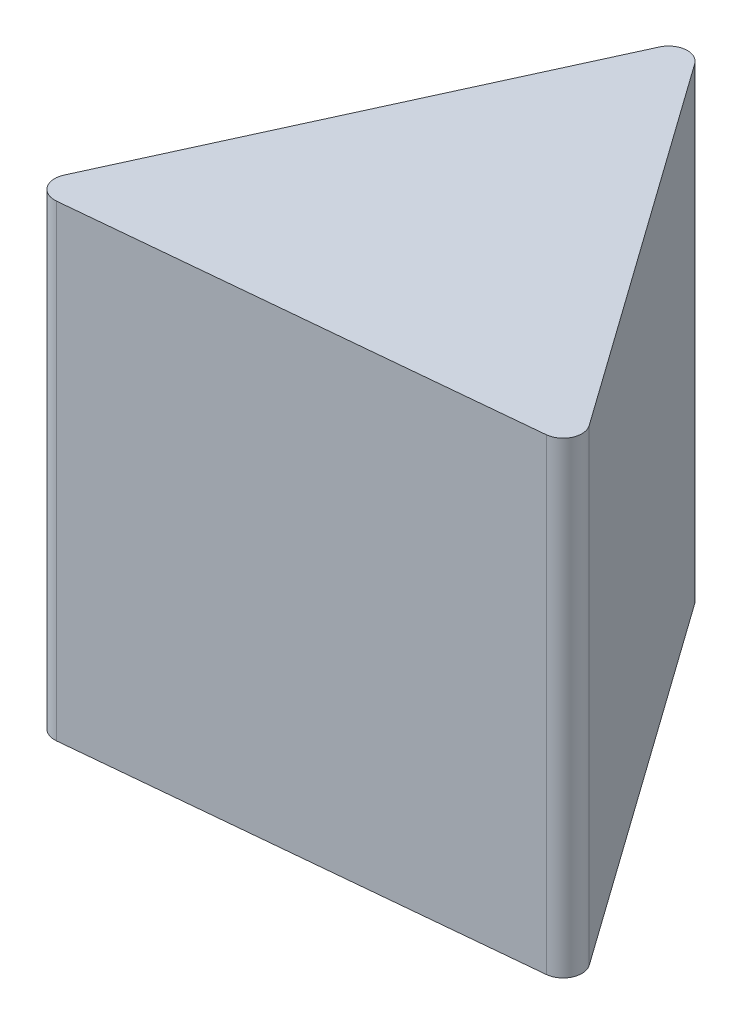
ISO-10303-21;
HEADER;
FILE_DESCRIPTION(('STEP AP214'),'2;1');
FILE_NAME('part.step','',(''),(''),'','','');
FILE_SCHEMA(('AUTOMOTIVE_DESIGN { 1 0 10303 214 1 1 1 1 }'));
ENDSEC;
DATA;
#1=APPLICATION_CONTEXT('core data for automotive mechanical design processes');
#2=APPLICATION_PROTOCOL_DEFINITION('international standard','automotive_design',2000,#1);
#3=PRODUCT_CONTEXT('',#1,'mechanical');
#4=PRODUCT('Part','Part','',(#3));
#5=PRODUCT_RELATED_PRODUCT_CATEGORY('part','',(#4));
#6=PRODUCT_DEFINITION_FORMATION('','',#4);
#7=PRODUCT_DEFINITION_CONTEXT('part definition',#1,'design');
#8=PRODUCT_DEFINITION('design','',#6,#7);
#9=PRODUCT_DEFINITION_SHAPE('','',#8);
#10=(LENGTH_UNIT() NAMED_UNIT(*) SI_UNIT(.MILLI.,.METRE.));
#11=(NAMED_UNIT(*) PLANE_ANGLE_UNIT() SI_UNIT($,.RADIAN.));
#12=(NAMED_UNIT(*) SI_UNIT($,.STERADIAN.) SOLID_ANGLE_UNIT());
#13=UNCERTAINTY_MEASURE_WITH_UNIT(LENGTH_MEASURE(1.E-05),#10,'distance_accuracy_value','');
#14=(GEOMETRIC_REPRESENTATION_CONTEXT(3) GLOBAL_UNCERTAINTY_ASSIGNED_CONTEXT((#13)) GLOBAL_UNIT_ASSIGNED_CONTEXT((#10,
#11,#12)) REPRESENTATION_CONTEXT('',''));
#15=CARTESIAN_POINT('',(0.,0.,0.));
#16=DIRECTION('',(0.,0.,1.));
#17=DIRECTION('',(1.,0.,0.));
#18=AXIS2_PLACEMENT_3D('',#15,#16,#17);
#19=CARTESIAN_POINT('',(-32.8401755263723,63.5,23.3730491529478));
#20=DIRECTION('',(-0.0948079174529441,0.,-0.995495584514686));
#21=DIRECTION('',(-0.995495584514686,0.,0.0948079174529441));
#22=AXIS2_PLACEMENT_3D('',#19,#20,#21);
#23=PLANE('',#22);
#24=DIRECTION('',(0.995495584514686,0.,-0.0948079174529441));
#25=VECTOR('',#24,1.);
#26=CARTESIAN_POINT('',(-32.8401755263723,0.,23.3730491529478));
#27=LINE('',#26,#25);
#28=CARTESIAN_POINT('',(-28.4605832414039,0.,22.9559503427775));
#29=VERTEX_POINT('',#28);
#30=CARTESIAN_POINT('',(32.2821498085729,0.,17.1710005042748));
#31=VERTEX_POINT('',#30);
#32=EDGE_CURVE('E138',#29,#31,#27,.T.);
#33=ORIENTED_EDGE('',*,*,#32,.T.);
#34=DIRECTION('',(0.,-1.,0.));
#35=VECTOR('',#34,1.);
#36=CARTESIAN_POINT('',(32.2821498085729,63.5,17.1710005042748));
#37=LINE('',#36,#35);
#38=CARTESIAN_POINT('',(32.2821498085729,63.5,17.1710005042748));
#39=VERTEX_POINT('',#38);
#40=EDGE_CURVE('E11',#31,#39,#37,.F.);
#41=ORIENTED_EDGE('',*,*,#40,.T.);
#42=DIRECTION('',(0.995495584514686,0.,-0.0948079174529441));
#43=VECTOR('',#42,1.);
#44=CARTESIAN_POINT('',(-32.8401755263723,63.5,23.3730491529478));
#45=LINE('',#44,#43);
#46=CARTESIAN_POINT('',(-28.4605832414039,63.5,22.9559503427775));
#47=VERTEX_POINT('',#46);
#48=EDGE_CURVE('E129',#47,#39,#45,.T.);
#49=ORIENTED_EDGE('',*,*,#48,.F.);
#50=DIRECTION('',(0.,-1.,0.));
#51=VECTOR('',#50,1.);
#52=CARTESIAN_POINT('',(-28.4605832414039,63.5,22.9559503427775));
#53=LINE('',#52,#51);
#54=EDGE_CURVE('E56',#47,#29,#53,.T.);
#55=ORIENTED_EDGE('',*,*,#54,.T.);
#56=EDGE_LOOP('',(#33,#41,#49,#55));
#57=FACE_BOUND('',#56,.T.);
#58=ADVANCED_FACE('F47',(#57),#23,.F.);
#59=CARTESIAN_POINT('',(36.6617420935412,63.5,16.7539016941045));
#60=DIRECTION('',(-0.814720506818485,0.,0.57985385725149));
#61=DIRECTION('',(0.57985385725149,0.,0.814720506818485));
#62=AXIS2_PLACEMENT_3D('',#59,#60,#61);
#63=PLANE('',#62);
#64=DIRECTION('',(-0.57985385725149,0.,-0.814720506818485));
#65=VECTOR('',#64,1.);
#66=CARTESIAN_POINT('',(36.6617420935412,0.,16.7539016941045));
#67=LINE('',#66,#65);
#68=CARTESIAN_POINT('',(34.1107277855613,0.,13.1696129221887));
#69=VERTEX_POINT('',#68);
#70=CARTESIAN_POINT('',(-1.27055225918907,0.,-36.5426620751364));
#71=VERTEX_POINT('',#70);
#72=EDGE_CURVE('E130',#69,#71,#67,.T.);
#73=ORIENTED_EDGE('',*,*,#72,.T.);
#74=DIRECTION('',(0.,-1.,0.));
#75=VECTOR('',#74,1.);
#76=CARTESIAN_POINT('',(-1.27055225918907,63.5,-36.5426620751364));
#77=LINE('',#76,#75);
#78=CARTESIAN_POINT('',(-1.27055225918907,63.5,-36.5426620751364));
#79=VERTEX_POINT('',#78);
#80=EDGE_CURVE('E106',#71,#79,#77,.F.);
#81=ORIENTED_EDGE('',*,*,#80,.T.);
#82=DIRECTION('',(-0.57985385725149,0.,-0.814720506818485));
#83=VECTOR('',#82,1.);
#84=CARTESIAN_POINT('',(36.6617420935412,63.5,16.7539016941045));
#85=LINE('',#84,#83);
#86=CARTESIAN_POINT('',(34.1107277855613,63.5,13.1696129221887));
#87=VERTEX_POINT('',#86);
#88=EDGE_CURVE('E135',#87,#79,#85,.T.);
#89=ORIENTED_EDGE('',*,*,#88,.F.);
#90=DIRECTION('',(0.,-1.,0.));
#91=VECTOR('',#90,1.);
#92=CARTESIAN_POINT('',(34.1107277855613,63.5,13.1696129221887));
#93=LINE('',#92,#91);
#94=EDGE_CURVE('E112',#87,#69,#93,.T.);
#95=ORIENTED_EDGE('',*,*,#94,.T.);
#96=EDGE_LOOP('',(#73,#81,#89,#95));
#97=FACE_BOUND('',#96,.T.);
#98=ADVANCED_FACE('F177',(#97),#63,.F.);
#99=CARTESIAN_POINT('',(-3.82156656716897,63.5,-40.1269508470522));
#100=DIRECTION('',(0.909528424271428,0.,0.415641727263196));
#101=DIRECTION('',(0.415641727263196,0.,-0.909528424271428));
#102=AXIS2_PLACEMENT_3D('',#99,#100,#101);
#103=PLANE('',#102);
#104=DIRECTION('',(-0.415641727263196,0.,0.909528424271428));
#105=VECTOR('',#104,1.);
#106=CARTESIAN_POINT('',(-3.82156656716897,63.5,-40.1269508470522));
#107=LINE('',#106,#105);
#108=CARTESIAN_POINT('',(-5.65014454415745,63.5,-36.1255632649662));
#109=VERTEX_POINT('',#108);
#110=CARTESIAN_POINT('',(-31.0115975493838,63.5,19.3716615708617));
#111=VERTEX_POINT('',#110);
#112=EDGE_CURVE('E121',#109,#111,#107,.T.);
#113=ORIENTED_EDGE('',*,*,#112,.F.);
#114=DIRECTION('',(0.,-1.,0.));
#115=VECTOR('',#114,1.);
#116=CARTESIAN_POINT('',(-5.65014454415745,63.5,-36.1255632649662));
#117=LINE('',#116,#115);
#118=CARTESIAN_POINT('',(-5.65014454415745,0.,-36.1255632649662));
#119=VERTEX_POINT('',#118);
#120=EDGE_CURVE('E105',#109,#119,#117,.T.);
#121=ORIENTED_EDGE('',*,*,#120,.T.);
#122=DIRECTION('',(-0.415641727263196,0.,0.909528424271428));
#123=VECTOR('',#122,1.);
#124=CARTESIAN_POINT('',(-3.82156656716897,0.,-40.1269508470522));
#125=LINE('',#124,#123);
#126=CARTESIAN_POINT('',(-31.0115975493838,0.,19.3716615708617));
#127=VERTEX_POINT('',#126);
#128=EDGE_CURVE('E119',#119,#127,#125,.T.);
#129=ORIENTED_EDGE('',*,*,#128,.T.);
#130=DIRECTION('',(0.,-1.,0.));
#131=VECTOR('',#130,1.);
#132=CARTESIAN_POINT('',(-31.0115975493838,63.5,19.3716615708617));
#133=LINE('',#132,#131);
#134=EDGE_CURVE('E124',#127,#111,#133,.F.);
#135=ORIENTED_EDGE('',*,*,#134,.T.);
#136=EDGE_LOOP('',(#113,#121,#129,#135));
#137=FACE_BOUND('',#136,.T.);
#138=ADVANCED_FACE('F118',(#137),#103,.F.);
#139=CARTESIAN_POINT('',(0.,63.5,0.));
#140=DIRECTION('',(0.,1.,0.));
#141=DIRECTION('',(0.,0.,1.));
#142=AXIS2_PLACEMENT_3D('',#139,#140,#141);
#143=PLANE('',#142);
#144=ORIENTED_EDGE('',*,*,#88,.T.);
#145=CARTESIAN_POINT('',(-3.33994234650802,63.5,-35.0698332777176));
#146=DIRECTION('',(0.,1.,0.));
#147=DIRECTION('',(0.,0.,1.));
#148=AXIS2_PLACEMENT_3D('',#145,#146,#147);
#149=CIRCLE('',#148,2.54);
#150=EDGE_CURVE('E157',#79,#109,#149,.T.);
#151=ORIENTED_EDGE('',*,*,#150,.T.);
#152=ORIENTED_EDGE('',*,*,#112,.T.);
#153=CARTESIAN_POINT('',(-28.7013953517344,63.5,20.4273915581102));
#154=DIRECTION('',(0.,1.,0.));
#155=DIRECTION('',(0.,0.,1.));
#156=AXIS2_PLACEMENT_3D('',#153,#154,#155);
#157=CIRCLE('',#156,2.54);
#158=EDGE_CURVE('E68',#111,#47,#157,.T.);
#159=ORIENTED_EDGE('',*,*,#158,.T.);
#160=ORIENTED_EDGE('',*,*,#48,.T.);
#161=CARTESIAN_POINT('',(32.0413376982424,63.5,14.6424417196075));
#162=DIRECTION('',(0.,1.,0.));
#163=DIRECTION('',(0.,0.,1.));
#164=AXIS2_PLACEMENT_3D('',#161,#162,#163);
#165=CIRCLE('',#164,2.54);
#166=EDGE_CURVE('E154',#39,#87,#165,.T.);
#167=ORIENTED_EDGE('',*,*,#166,.T.);
#168=EDGE_LOOP('',(#144,#151,#152,#159,#160,#167));
#169=FACE_BOUND('',#168,.T.);
#170=ADVANCED_FACE('F173',(#169),#143,.T.);
#171=CARTESIAN_POINT('',(0.,0.,0.));
#172=DIRECTION('',(0.,1.,0.));
#173=DIRECTION('',(0.,0.,1.));
#174=AXIS2_PLACEMENT_3D('',#171,#172,#173);
#175=PLANE('',#174);
#176=ORIENTED_EDGE('',*,*,#128,.F.);
#177=CARTESIAN_POINT('',(-3.33994234650802,0.,-35.0698332777176));
#178=DIRECTION('',(0.,1.,0.));
#179=DIRECTION('',(0.,0.,1.));
#180=AXIS2_PLACEMENT_3D('',#177,#178,#179);
#181=CIRCLE('',#180,2.54);
#182=EDGE_CURVE('E101',#119,#71,#181,.F.);
#183=ORIENTED_EDGE('',*,*,#182,.T.);
#184=ORIENTED_EDGE('',*,*,#72,.F.);
#185=CARTESIAN_POINT('',(32.0413376982424,0.,14.6424417196075));
#186=DIRECTION('',(0.,1.,0.));
#187=DIRECTION('',(0.,0.,1.));
#188=AXIS2_PLACEMENT_3D('',#185,#186,#187);
#189=CIRCLE('',#188,2.54);
#190=EDGE_CURVE('E113',#69,#31,#189,.F.);
#191=ORIENTED_EDGE('',*,*,#190,.T.);
#192=ORIENTED_EDGE('',*,*,#32,.F.);
#193=CARTESIAN_POINT('',(-28.7013953517344,0.,20.4273915581102));
#194=DIRECTION('',(0.,1.,0.));
#195=DIRECTION('',(0.,0.,1.));
#196=AXIS2_PLACEMENT_3D('',#193,#194,#195);
#197=CIRCLE('',#196,2.54);
#198=EDGE_CURVE('E123',#29,#127,#197,.F.);
#199=ORIENTED_EDGE('',*,*,#198,.T.);
#200=EDGE_LOOP('',(#176,#183,#184,#191,#192,#199));
#201=FACE_BOUND('',#200,.T.);
#202=ADVANCED_FACE('F126',(#201),#175,.F.);
#203=CARTESIAN_POINT('',(-3.33994234650802,63.5,-35.0698332777176));
#204=DIRECTION('',(0.,-1.,0.));
#205=DIRECTION('',(0.,0.,-1.));
#206=AXIS2_PLACEMENT_3D('',#203,#204,#205);
#207=CYLINDRICAL_SURFACE('',#206,2.54);
#208=ORIENTED_EDGE('',*,*,#150,.F.);
#209=ORIENTED_EDGE('',*,*,#80,.F.);
#210=ORIENTED_EDGE('',*,*,#182,.F.);
#211=ORIENTED_EDGE('',*,*,#120,.F.);
#212=EDGE_LOOP('',(#208,#209,#210,#211));
#213=FACE_BOUND('',#212,.T.);
#214=ADVANCED_FACE('F104',(#213),#207,.T.);
#215=CARTESIAN_POINT('',(32.0413376982424,63.5,14.6424417196075));
#216=DIRECTION('',(0.,-1.,0.));
#217=DIRECTION('',(0.,0.,-1.));
#218=AXIS2_PLACEMENT_3D('',#215,#216,#217);
#219=CYLINDRICAL_SURFACE('',#218,2.54);
#220=ORIENTED_EDGE('',*,*,#166,.F.);
#221=ORIENTED_EDGE('',*,*,#40,.F.);
#222=ORIENTED_EDGE('',*,*,#190,.F.);
#223=ORIENTED_EDGE('',*,*,#94,.F.);
#224=EDGE_LOOP('',(#220,#221,#222,#223));
#225=FACE_BOUND('',#224,.T.);
#226=ADVANCED_FACE('F179',(#225),#219,.T.);
#227=CARTESIAN_POINT('',(-28.7013953517344,63.5,20.4273915581102));
#228=DIRECTION('',(0.,-1.,0.));
#229=DIRECTION('',(0.,0.,-1.));
#230=AXIS2_PLACEMENT_3D('',#227,#228,#229);
#231=CYLINDRICAL_SURFACE('',#230,2.54);
#232=ORIENTED_EDGE('',*,*,#158,.F.);
#233=ORIENTED_EDGE('',*,*,#134,.F.);
#234=ORIENTED_EDGE('',*,*,#198,.F.);
#235=ORIENTED_EDGE('',*,*,#54,.F.);
#236=EDGE_LOOP('',(#232,#233,#234,#235));
#237=FACE_BOUND('',#236,.T.);
#238=ADVANCED_FACE('F49',(#237),#231,.T.);
#239=CLOSED_SHELL('',(#58,#98,#138,#170,#202,#214,#226,#238));
#240=MANIFOLD_SOLID_BREP('B2',#239);
#241=ADVANCED_BREP_SHAPE_REPRESENTATION('',(#18,#240),#14);
#242=SHAPE_DEFINITION_REPRESENTATION(#9,#241);
ENDSEC;
END-ISO-10303-21;
